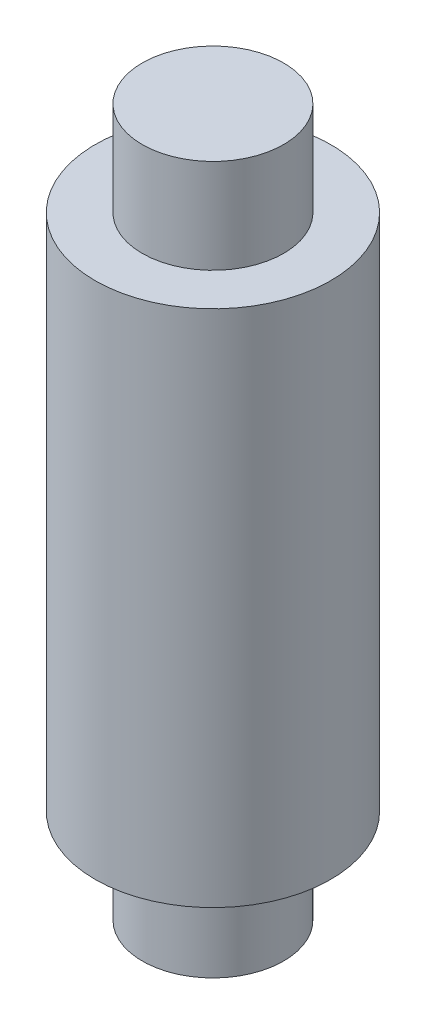
ISO-10303-21;
HEADER;
FILE_DESCRIPTION(('STEP AP214'),'2;1');
FILE_NAME('part.step','',(''),(''),'','','');
FILE_SCHEMA(('AUTOMOTIVE_DESIGN { 1 0 10303 214 1 1 1 1 }'));
ENDSEC;
DATA;
#1=APPLICATION_CONTEXT('core data for automotive mechanical design processes');
#2=APPLICATION_PROTOCOL_DEFINITION('international standard','automotive_design',2000,#1);
#3=PRODUCT_CONTEXT('',#1,'mechanical');
#4=PRODUCT('Part','Part','',(#3));
#5=PRODUCT_RELATED_PRODUCT_CATEGORY('part','',(#4));
#6=PRODUCT_DEFINITION_FORMATION('','',#4);
#7=PRODUCT_DEFINITION_CONTEXT('part definition',#1,'design');
#8=PRODUCT_DEFINITION('design','',#6,#7);
#9=PRODUCT_DEFINITION_SHAPE('','',#8);
#10=(LENGTH_UNIT() NAMED_UNIT(*) SI_UNIT(.MILLI.,.METRE.));
#11=(NAMED_UNIT(*) PLANE_ANGLE_UNIT() SI_UNIT($,.RADIAN.));
#12=(NAMED_UNIT(*) SI_UNIT($,.STERADIAN.) SOLID_ANGLE_UNIT());
#13=UNCERTAINTY_MEASURE_WITH_UNIT(LENGTH_MEASURE(1.E-05),#10,'distance_accuracy_value','');
#14=(GEOMETRIC_REPRESENTATION_CONTEXT(3) GLOBAL_UNCERTAINTY_ASSIGNED_CONTEXT((#13)) GLOBAL_UNIT_ASSIGNED_CONTEXT((#10,
#11,#12)) REPRESENTATION_CONTEXT('',''));
#15=CARTESIAN_POINT('',(0.,0.,0.));
#16=DIRECTION('',(0.,0.,1.));
#17=DIRECTION('',(1.,0.,0.));
#18=AXIS2_PLACEMENT_3D('',#15,#16,#17);
#19=CARTESIAN_POINT('',(0.,11.,0.));
#20=DIRECTION('',(0.,-1.,0.));
#21=DIRECTION('',(0.,0.,-1.));
#22=AXIS2_PLACEMENT_3D('',#19,#20,#21);
#23=CYLINDRICAL_SURFACE('',#22,2.5);
#24=CARTESIAN_POINT('',(0.,11.,0.));
#25=DIRECTION('',(0.,1.,0.));
#26=DIRECTION('',(0.,0.,1.));
#27=AXIS2_PLACEMENT_3D('',#24,#25,#26);
#28=CIRCLE('',#27,2.5);
#29=CARTESIAN_POINT('',(0.,11.,2.5));
#30=VERTEX_POINT('',#29);
#31=EDGE_CURVE('E51',#30,#30,#28,.T.);
#32=ORIENTED_EDGE('',*,*,#31,.F.);
#33=EDGE_LOOP('',(#32));
#34=FACE_BOUND('',#33,.T.);
#35=CARTESIAN_POINT('',(0.,0.,0.));
#36=DIRECTION('',(0.,1.,0.));
#37=DIRECTION('',(0.,0.,1.));
#38=AXIS2_PLACEMENT_3D('',#35,#36,#37);
#39=CIRCLE('',#38,2.5);
#40=CARTESIAN_POINT('',(0.,0.,2.5));
#41=VERTEX_POINT('',#40);
#42=EDGE_CURVE('E40',#41,#41,#39,.T.);
#43=ORIENTED_EDGE('',*,*,#42,.T.);
#44=EDGE_LOOP('',(#43));
#45=FACE_BOUND('',#44,.T.);
#46=ADVANCED_FACE('F37',(#34,#45),#23,.T.);
#47=CARTESIAN_POINT('',(0.,11.,0.));
#48=DIRECTION('',(0.,1.,0.));
#49=DIRECTION('',(0.,0.,1.));
#50=AXIS2_PLACEMENT_3D('',#47,#48,#49);
#51=PLANE('',#50);
#52=CARTESIAN_POINT('',(0.,11.,0.));
#53=DIRECTION('',(0.,1.,0.));
#54=DIRECTION('',(0.,0.,1.));
#55=AXIS2_PLACEMENT_3D('',#52,#53,#54);
#56=CIRCLE('',#55,1.5);
#57=CARTESIAN_POINT('',(0.,11.,1.5));
#58=VERTEX_POINT('',#57);
#59=EDGE_CURVE('E45',#58,#58,#56,.T.);
#60=ORIENTED_EDGE('',*,*,#59,.F.);
#61=EDGE_LOOP('',(#60));
#62=FACE_BOUND('',#61,.T.);
#63=ORIENTED_EDGE('',*,*,#31,.T.);
#64=EDGE_LOOP('',(#63));
#65=FACE_BOUND('',#64,.T.);
#66=ADVANCED_FACE('F71',(#62,#65),#51,.T.);
#67=CARTESIAN_POINT('',(0.,0.,0.));
#68=DIRECTION('',(0.,1.,0.));
#69=DIRECTION('',(0.,0.,1.));
#70=AXIS2_PLACEMENT_3D('',#67,#68,#69);
#71=PLANE('',#70);
#72=CARTESIAN_POINT('',(0.,0.,0.));
#73=DIRECTION('',(0.,-1.,0.));
#74=DIRECTION('',(0.,0.,-1.));
#75=AXIS2_PLACEMENT_3D('',#72,#73,#74);
#76=CIRCLE('',#75,1.5);
#77=CARTESIAN_POINT('',(0.,0.,-1.5));
#78=VERTEX_POINT('',#77);
#79=EDGE_CURVE('E10',#78,#78,#76,.T.);
#80=ORIENTED_EDGE('',*,*,#79,.F.);
#81=EDGE_LOOP('',(#80));
#82=FACE_BOUND('',#81,.T.);
#83=ORIENTED_EDGE('',*,*,#42,.F.);
#84=EDGE_LOOP('',(#83));
#85=FACE_BOUND('',#84,.T.);
#86=ADVANCED_FACE('F68',(#82,#85),#71,.F.);
#87=CARTESIAN_POINT('',(0.,13.,0.));
#88=DIRECTION('',(0.,-1.,0.));
#89=DIRECTION('',(0.,0.,-1.));
#90=AXIS2_PLACEMENT_3D('',#87,#88,#89);
#91=CYLINDRICAL_SURFACE('',#90,1.5);
#92=CARTESIAN_POINT('',(0.,13.,0.));
#93=DIRECTION('',(0.,1.,0.));
#94=DIRECTION('',(0.,0.,1.));
#95=AXIS2_PLACEMENT_3D('',#92,#93,#94);
#96=CIRCLE('',#95,1.5);
#97=CARTESIAN_POINT('',(0.,13.,1.5));
#98=VERTEX_POINT('',#97);
#99=EDGE_CURVE('E56',#98,#98,#96,.T.);
#100=ORIENTED_EDGE('',*,*,#99,.F.);
#101=EDGE_LOOP('',(#100));
#102=FACE_BOUND('',#101,.T.);
#103=ORIENTED_EDGE('',*,*,#59,.T.);
#104=EDGE_LOOP('',(#103));
#105=FACE_BOUND('',#104,.T.);
#106=ADVANCED_FACE('F70',(#102,#105),#91,.T.);
#107=CARTESIAN_POINT('',(0.,13.,0.));
#108=DIRECTION('',(0.,1.,0.));
#109=DIRECTION('',(0.,0.,1.));
#110=AXIS2_PLACEMENT_3D('',#107,#108,#109);
#111=PLANE('',#110);
#112=ORIENTED_EDGE('',*,*,#99,.T.);
#113=EDGE_LOOP('',(#112));
#114=FACE_BOUND('',#113,.T.);
#115=ADVANCED_FACE('F77',(#114),#111,.T.);
#116=CARTESIAN_POINT('',(0.,-2.,0.));
#117=DIRECTION('',(0.,1.,0.));
#118=DIRECTION('',(0.,0.,1.));
#119=AXIS2_PLACEMENT_3D('',#116,#117,#118);
#120=CYLINDRICAL_SURFACE('',#119,1.5);
#121=CARTESIAN_POINT('',(0.,-2.,0.));
#122=DIRECTION('',(0.,-1.,0.));
#123=DIRECTION('',(0.,0.,-1.));
#124=AXIS2_PLACEMENT_3D('',#121,#122,#123);
#125=CIRCLE('',#124,1.5);
#126=CARTESIAN_POINT('',(0.,-2.,-1.5));
#127=VERTEX_POINT('',#126);
#128=EDGE_CURVE('E55',#127,#127,#125,.T.);
#129=ORIENTED_EDGE('',*,*,#128,.F.);
#130=EDGE_LOOP('',(#129));
#131=FACE_BOUND('',#130,.T.);
#132=ORIENTED_EDGE('',*,*,#79,.T.);
#133=EDGE_LOOP('',(#132));
#134=FACE_BOUND('',#133,.T.);
#135=ADVANCED_FACE('F105',(#131,#134),#120,.T.);
#136=CARTESIAN_POINT('',(0.,-2.,0.));
#137=DIRECTION('',(0.,-1.,0.));
#138=DIRECTION('',(0.,0.,-1.));
#139=AXIS2_PLACEMENT_3D('',#136,#137,#138);
#140=PLANE('',#139);
#141=ORIENTED_EDGE('',*,*,#128,.T.);
#142=EDGE_LOOP('',(#141));
#143=FACE_BOUND('',#142,.T.);
#144=ADVANCED_FACE('F119',(#143),#140,.T.);
#145=CLOSED_SHELL('',(#46,#66,#86,#106,#115,#135,#144));
#146=MANIFOLD_SOLID_BREP('B2',#145);
#147=ADVANCED_BREP_SHAPE_REPRESENTATION('',(#18,#146),#14);
#148=SHAPE_DEFINITION_REPRESENTATION(#9,#147);
ENDSEC;
END-ISO-10303-21;
